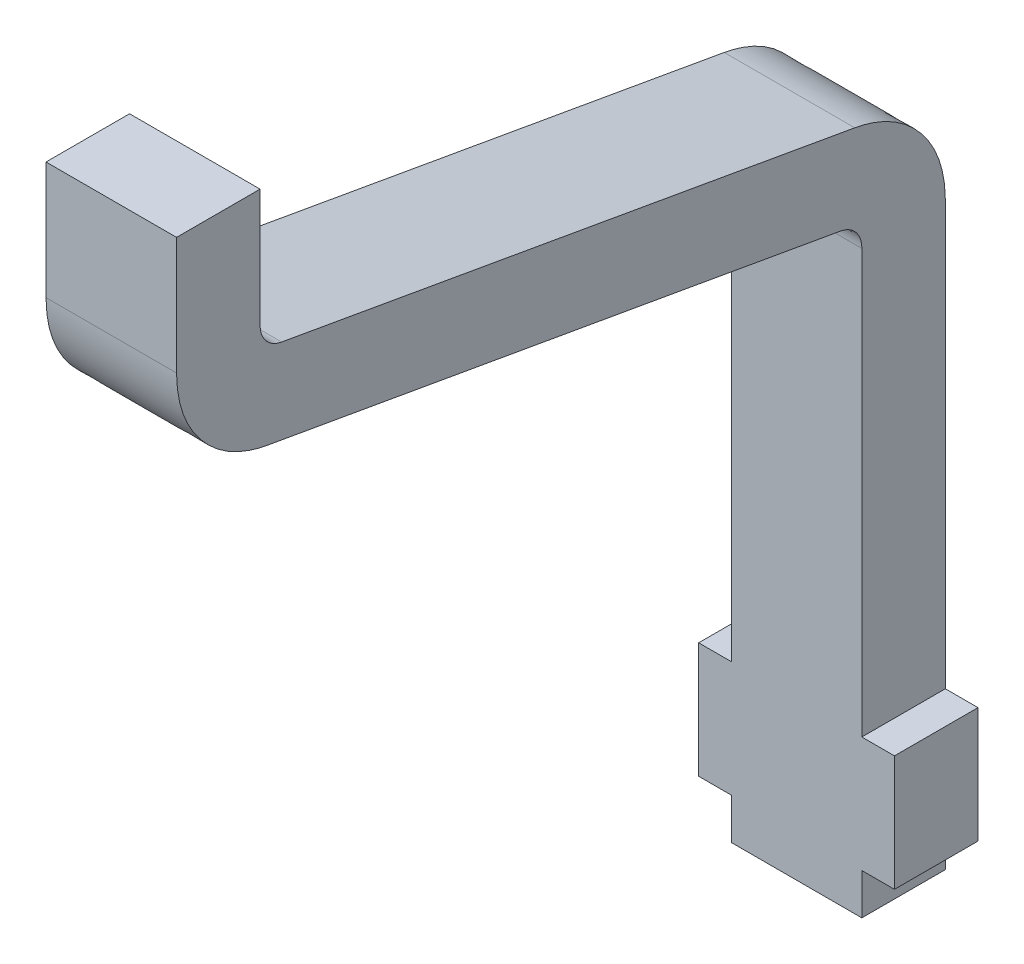
ISO-10303-21;
HEADER;
FILE_DESCRIPTION(('STEP AP214'),'2;1');
FILE_NAME('part.step','',(''),(''),'','','');
FILE_SCHEMA(('AUTOMOTIVE_DESIGN { 1 0 10303 214 1 1 1 1 }'));
ENDSEC;
DATA;
#1=APPLICATION_CONTEXT('core data for automotive mechanical design processes');
#2=APPLICATION_PROTOCOL_DEFINITION('international standard','automotive_design',2000,#1);
#3=PRODUCT_CONTEXT('',#1,'mechanical');
#4=PRODUCT('Part','Part','',(#3));
#5=PRODUCT_RELATED_PRODUCT_CATEGORY('part','',(#4));
#6=PRODUCT_DEFINITION_FORMATION('','',#4);
#7=PRODUCT_DEFINITION_CONTEXT('part definition',#1,'design');
#8=PRODUCT_DEFINITION('design','',#6,#7);
#9=PRODUCT_DEFINITION_SHAPE('','',#8);
#10=(LENGTH_UNIT() NAMED_UNIT(*) SI_UNIT(.MILLI.,.METRE.));
#11=(NAMED_UNIT(*) PLANE_ANGLE_UNIT() SI_UNIT($,.RADIAN.));
#12=(NAMED_UNIT(*) SI_UNIT($,.STERADIAN.) SOLID_ANGLE_UNIT());
#13=UNCERTAINTY_MEASURE_WITH_UNIT(LENGTH_MEASURE(1.E-05),#10,'distance_accuracy_value','');
#14=(GEOMETRIC_REPRESENTATION_CONTEXT(3) GLOBAL_UNCERTAINTY_ASSIGNED_CONTEXT((#13)) GLOBAL_UNIT_ASSIGNED_CONTEXT((#10,
#11,#12)) REPRESENTATION_CONTEXT('',''));
#15=CARTESIAN_POINT('',(0.,0.,0.));
#16=DIRECTION('',(0.,0.,1.));
#17=DIRECTION('',(1.,0.,0.));
#18=AXIS2_PLACEMENT_3D('',#15,#16,#17);
#19=CARTESIAN_POINT('',(-6.77863807396374,4.550984547896,2.240984547896));
#20=DIRECTION('',(-1.,0.,0.));
#21=DIRECTION('',(0.,0.,1.));
#22=AXIS2_PLACEMENT_3D('',#19,#20,#21);
#23=PLANE('',#22);
#24=DIRECTION('',(0.,1.,0.));
#25=VECTOR('',#24,1.);
#26=CARTESIAN_POINT('',(-6.77863807396374,6.33179441896759,2.270984547896));
#27=LINE('',#26,#25);
#28=CARTESIAN_POINT('',(-6.77863807396374,4.580984547896,2.270984547896));
#29=VERTEX_POINT('',#28);
#30=CARTESIAN_POINT('',(-6.77863807396374,6.20179441896759,2.270984547896));
#31=VERTEX_POINT('',#30);
#32=EDGE_CURVE('E205',#29,#31,#27,.T.);
#33=ORIENTED_EDGE('',*,*,#32,.F.);
#34=DIRECTION('',(0.,0.,1.));
#35=VECTOR('',#34,1.);
#36=CARTESIAN_POINT('',(-6.77863807396374,4.580984547896,2.590984547896));
#37=LINE('',#36,#35);
#38=CARTESIAN_POINT('',(-6.77863807396374,4.580984547896,2.590984547896));
#39=VERTEX_POINT('',#38);
#40=EDGE_CURVE('E164',#39,#29,#37,.F.);
#41=ORIENTED_EDGE('',*,*,#40,.F.);
#42=DIRECTION('',(0.,1.,0.));
#43=VECTOR('',#42,1.);
#44=CARTESIAN_POINT('',(-6.77863807396374,4.550984547896,2.590984547896));
#45=LINE('',#44,#43);
#46=CARTESIAN_POINT('',(-6.77863807396374,6.20179441896759,2.590984547896));
#47=VERTEX_POINT('',#46);
#48=EDGE_CURVE('E165',#39,#47,#45,.T.);
#49=ORIENTED_EDGE('',*,*,#48,.T.);
#50=CARTESIAN_POINT('',(-6.77863807396374,6.20179441896759,2.590984547896));
#51=CARTESIAN_POINT('',(-6.77863807396374,6.20753726743895,2.59098555734567));
#52=CARTESIAN_POINT('',(-6.77863807396374,6.21329671503778,2.59141589816356));
#53=CARTESIAN_POINT('',(-6.77863807396374,6.2246630836897,2.59320291073655));
#54=CARTESIAN_POINT('',(-6.77863807396374,6.23027011249996,2.59455890937196));
#55=CARTESIAN_POINT('',(-6.77863807396374,6.2411857001178,2.598275233232));
#56=CARTESIAN_POINT('',(-6.77863807396374,6.24649238283284,2.60064121897459));
#57=CARTESIAN_POINT('',(-6.77863807396374,6.25657549196221,2.60629315965504));
#58=CARTESIAN_POINT('',(-6.77863807396374,6.26135201782258,2.60957894165025));
#59=CARTESIAN_POINT('',(-6.77863807396374,6.27413109218183,2.62012274423325));
#60=CARTESIAN_POINT('',(-6.77863807396374,6.28136928946846,2.62836469975794));
#61=CARTESIAN_POINT('',(-6.77863807396374,6.29260513360912,2.64684944116525));
#62=CARTESIAN_POINT('',(-6.77863807396374,6.2965887855171,2.65710063541284));
#63=CARTESIAN_POINT('',(-6.77863807396374,6.29950962689028,2.66961713994528));
#64=CARTESIAN_POINT('',(-6.77863807396374,6.29991925593881,2.67161590506469));
#65=CARTESIAN_POINT('',(-6.77863807396374,6.30027519062532,2.67361973012931));
#66=B_SPLINE_CURVE_WITH_KNOTS('',3,(#50,#51,#52,#53,#54,#55,#56,#57,#58,#59,#60,#61,#62,#63,#64,
#65),.UNSPECIFIED.,.F.,.F.,(4,2,2,2,2,2,2,4),(0.,0.017238556161182,0.0344645901270159,
0.051788462578373,0.0691090799322486,0.101346274442221,0.133721373842736,0.139837752769888),.UNSPECIFIED.);
#67=CARTESIAN_POINT('',(-6.77863807396374,6.30027519062532,2.67361973012931));
#68=VERTEX_POINT('',#67);
#69=EDGE_CURVE('E21',#47,#68,#66,.T.);
#70=ORIENTED_EDGE('',*,*,#69,.T.);
#71=DIRECTION('',(0.,-0.17364817766693,-0.984807753012208));
#72=VECTOR('',#71,1.);
#73=CARTESIAN_POINT('',(-6.77863807396374,6.29506574529531,2.64407549753894));
#74=LINE('',#73,#72);
#75=CARTESIAN_POINT('',(-6.77863807396374,6.68736529163123,4.86891678251813));
#76=VERTEX_POINT('',#75);
#77=EDGE_CURVE('E178',#76,#68,#74,.T.);
#78=ORIENTED_EDGE('',*,*,#77,.F.);
#79=CARTESIAN_POINT('',(-6.77863807396374,7.100984547896,5.215984547896));
#80=CARTESIAN_POINT('',(-6.77863807396374,7.08883239009785,5.21591937646065));
#81=CARTESIAN_POINT('',(-6.77863807396374,7.07668339031452,5.21542711815011));
#82=CARTESIAN_POINT('',(-6.77863807396374,7.05244664482613,5.21351918836624));
#83=CARTESIAN_POINT('',(-6.77863807396374,7.04035897381041,5.21210258013317));
#84=CARTESIAN_POINT('',(-6.77863807396374,7.00434073280114,5.20636882201667));
#85=CARTESIAN_POINT('',(-6.77863807396374,6.9806210880306,5.20056793472031));
#86=CARTESIAN_POINT('',(-6.77863807396374,6.93447520894348,5.18473229114928));
#87=CARTESIAN_POINT('',(-6.77863807396374,6.91205738089935,5.17467289082895));
#88=CARTESIAN_POINT('',(-6.77863807396374,6.8694801210754,5.15060119772105));
#89=CARTESIAN_POINT('',(-6.77863807396374,6.84931965006307,5.1365907344473));
#90=CARTESIAN_POINT('',(-6.77863807396374,6.8130782802624,5.10643618649113));
#91=CARTESIAN_POINT('',(-6.77863807396374,6.7968081946306,5.09051824531871));
#92=CARTESIAN_POINT('',(-6.77863807396374,6.76721693386031,5.05614511573609));
#93=CARTESIAN_POINT('',(-6.77863807396374,6.75389373220741,5.03769168517858));
#94=CARTESIAN_POINT('',(-6.77863807396374,6.73056491746072,4.99877720264064));
#95=CARTESIAN_POINT('',(-6.77863807396374,6.72056340569958,4.97831370888659));
#96=CARTESIAN_POINT('',(-6.77863807396374,6.7039204026696,4.93608869922421));
#97=CARTESIAN_POINT('',(-6.77863807396374,6.69727752754475,4.91432772205521));
#98=CARTESIAN_POINT('',(-6.77863807396374,6.69038259357711,4.88449758435802));
#99=CARTESIAN_POINT('',(-6.77863807396374,6.68878280972664,4.87672074513799));
#100=CARTESIAN_POINT('',(-6.77863807396374,6.68736529163123,4.86891678251813));
#101=B_SPLINE_CURVE_WITH_KNOTS('',3,(#79,#80,#81,#82,#83,#84,#85,#86,#87,#88,#89,#90,#91,#92,
#93,#94,#95,#96,#97,#98,#99,#100),.UNSPECIFIED.,.F.,.F.,(4,2,2,2,2,2,2,2,2,2,4),(0.,
0.0364447161959692,0.0729264238784269,0.145789443137374,0.219080012919287,0.292336701548788,
0.360320805384211,0.428258011516145,0.4962787914031,0.564271521863333,0.588078345120833),.UNSPECIFIED.);
#102=CARTESIAN_POINT('',(-6.77863807396374,7.100984547896,5.215984547896));
#103=VERTEX_POINT('',#102);
#104=EDGE_CURVE('E285',#103,#76,#101,.T.);
#105=ORIENTED_EDGE('',*,*,#104,.F.);
#106=DIRECTION('',(0.,1.,0.));
#107=VECTOR('',#106,1.);
#108=CARTESIAN_POINT('',(-6.77863807396374,7.070984547896,5.215984547896));
#109=LINE('',#108,#107);
#110=CARTESIAN_POINT('',(-6.77863807396374,7.550984547896,5.215984547896));
#111=VERTEX_POINT('',#110);
#112=EDGE_CURVE('E182',#111,#103,#109,.F.);
#113=ORIENTED_EDGE('',*,*,#112,.F.);
#114=DIRECTION('',(0.,0.,-1.));
#115=VECTOR('',#114,1.);
#116=CARTESIAN_POINT('',(-6.77863807396374,7.550984547896,5.24598454789601));
#117=LINE('',#116,#115);
#118=CARTESIAN_POINT('',(-6.77863807396374,7.550984547896,4.895984547896));
#119=VERTEX_POINT('',#118);
#120=EDGE_CURVE('E188',#111,#119,#117,.T.);
#121=ORIENTED_EDGE('',*,*,#120,.T.);
#122=DIRECTION('',(0.,1.,0.));
#123=VECTOR('',#122,1.);
#124=CARTESIAN_POINT('',(-6.77863807396374,7.070984547896,4.895984547896));
#125=LINE('',#124,#123);
#126=CARTESIAN_POINT('',(-6.77863807396374,7.100984547896,4.895984547896));
#127=VERTEX_POINT('',#126);
#128=EDGE_CURVE('E194',#127,#119,#125,.T.);
#129=ORIENTED_EDGE('',*,*,#128,.F.);
#130=CARTESIAN_POINT('',(-6.77863807396374,7.00250377259513,4.81334936566471));
#131=CARTESIAN_POINT('',(-6.77863807396374,7.00350200195311,4.81900479247235));
#132=CARTESIAN_POINT('',(-6.77863807396374,7.0049259226042,4.82460201361728));
#133=CARTESIAN_POINT('',(-6.77863807396374,7.00865953589999,4.83548539089273));
#134=CARTESIAN_POINT('',(-6.77863807396374,7.0109685843645,4.84077177002885));
#135=CARTESIAN_POINT('',(-6.77863807396374,7.01652392120461,4.85087619321296));
#136=CARTESIAN_POINT('',(-6.77863807396374,7.01977545832262,4.85569140673157));
#137=CARTESIAN_POINT('',(-6.77863807396374,7.02709244738196,4.86463988221837));
#138=CARTESIAN_POINT('',(-6.77863807396374,7.03115774627628,4.86877327215326));
#139=CARTESIAN_POINT('',(-6.77863807396374,7.04376042862659,4.8795272921308));
#140=CARTESIAN_POINT('',(-6.77863807396374,7.05313407071043,4.88522432458835));
#141=CARTESIAN_POINT('',(-6.77863807396374,7.07328907191604,4.89307962900701));
#142=CARTESIAN_POINT('',(-6.77863807396374,7.08407628137846,4.89522265876101));
#143=CARTESIAN_POINT('',(-6.77863807396374,7.09690982963115,4.89592565734588));
#144=CARTESIAN_POINT('',(-6.77863807396374,7.09894935918849,4.89598198122784));
#145=CARTESIAN_POINT('',(-6.77863807396374,7.100984547896,4.895984547896));
#146=B_SPLINE_CURVE_WITH_KNOTS('',3,(#130,#131,#132,#133,#134,#135,#136,#137,#138,#139,#140,
#141,#142,#143,#144,#145),.UNSPECIFIED.,.F.,.F.,(4,2,2,2,2,2,2,4),(0.,0.0172385573765554,
0.0344645925861347,0.051788466289741,0.0691090848881165,0.101346281177337,0.133721380344783,
0.139837755776289),.UNSPECIFIED.);
#147=CARTESIAN_POINT('',(-6.77863807396374,7.00250377259513,4.81334936566471));
#148=VERTEX_POINT('',#147);
#149=EDGE_CURVE('E313',#148,#127,#146,.T.);
#150=ORIENTED_EDGE('',*,*,#149,.F.);
#151=DIRECTION('',(0.,0.17364817766693,0.984807753012208));
#152=VECTOR('',#151,1.);
#153=CARTESIAN_POINT('',(-6.77863807396374,6.61020422625922,2.58850808068553));
#154=LINE('',#153,#152);
#155=CARTESIAN_POINT('',(-6.77863807396374,6.61541367158922,2.61805231327589));
#156=VERTEX_POINT('',#155);
#157=EDGE_CURVE('E200',#156,#148,#154,.T.);
#158=ORIENTED_EDGE('',*,*,#157,.F.);
#159=CARTESIAN_POINT('',(-6.77863807396374,6.20179441896759,2.270984547896));
#160=CARTESIAN_POINT('',(-6.77863807396374,6.2139465765696,2.27104971933121));
#161=CARTESIAN_POINT('',(-6.77863807396374,6.22609557615675,2.27154197763767));
#162=CARTESIAN_POINT('',(-6.77863807396374,6.2503323212524,2.27344990740251));
#163=CARTESIAN_POINT('',(-6.77863807396374,6.26241999207158,2.27486651562058));
#164=CARTESIAN_POINT('',(-6.77863807396374,6.29843823248389,2.28060027366992));
#165=CARTESIAN_POINT('',(-6.77863807396374,6.32215787685567,2.28640116089191));
#166=CARTESIAN_POINT('',(-6.77863807396374,6.36830375516317,2.30223680422815));
#167=CARTESIAN_POINT('',(-6.77863807396374,6.39072158282685,2.31229620438677));
#168=CARTESIAN_POINT('',(-6.77863807396374,6.43329884194366,2.33636789708385));
#169=CARTESIAN_POINT('',(-6.77863807396374,6.45345931262897,2.35037836010908));
#170=CARTESIAN_POINT('',(-6.77863807396374,6.48970068196938,2.38053290757986));
#171=CARTESIAN_POINT('',(-6.77863807396374,6.50597076744986,2.3964508485364));
#172=CARTESIAN_POINT('',(-6.77863807396374,6.53556202799779,2.43082397763534));
#173=CARTESIAN_POINT('',(-6.77863807396374,6.54888522957937,2.44927740792529));
#174=CARTESIAN_POINT('',(-6.77863807396374,6.57221404440498,2.48819189012085));
#175=CARTESIAN_POINT('',(-6.77863807396374,6.58221555627867,2.50865538382254));
#176=CARTESIAN_POINT('',(-6.77863807396374,6.59885855954947,2.55088039339732));
#177=CARTESIAN_POINT('',(-6.77863807396374,6.60550143480209,2.57264137053124));
#178=CARTESIAN_POINT('',(-6.77863807396374,6.61239636920221,2.6024715092705));
#179=CARTESIAN_POINT('',(-6.77863807396374,6.6139961532976,2.61024834956975));
#180=CARTESIAN_POINT('',(-6.77863807396374,6.61541367158922,2.61805231327589));
#181=B_SPLINE_CURVE_WITH_KNOTS('',3,(#159,#160,#161,#162,#163,#164,#165,#166,#167,#168,#169,
#170,#171,#172,#173,#174,#175,#176,#177,#178,#179,#180),.UNSPECIFIED.,.F.,.F.,(4,2,2,2,2,2,2,2,
2,2,4),(0.,0.036444715607616,0.0729264226993133,0.145789440750173,0.219080009303174,
0.29233669671443,0.360320799781691,0.428258005151271,0.496278785044542,0.564271515521181,
0.588078342093036),.UNSPECIFIED.);
#182=EDGE_CURVE('E221',#31,#156,#181,.T.);
#183=ORIENTED_EDGE('',*,*,#182,.F.);
#184=EDGE_LOOP('',(#33,#41,#49,#70,#78,#105,#113,#121,#129,#150,#158,#183));
#185=FACE_BOUND('',#184,.T.);
#186=ADVANCED_FACE('F17',(#185),#23,.T.);
#187=CARTESIAN_POINT('',(-6.90363807396374,4.580984547896,2.590984547896));
#188=DIRECTION('',(0.,1.,0.));
#189=DIRECTION('',(0.,0.,1.));
#190=AXIS2_PLACEMENT_3D('',#187,#188,#189);
#191=PLANE('',#190);
#192=DIRECTION('',(0.,0.,1.));
#193=VECTOR('',#192,1.);
#194=CARTESIAN_POINT('',(-6.90363807396374,4.580984547896,2.590984547896));
#195=LINE('',#194,#193);
#196=CARTESIAN_POINT('',(-6.90363807396374,4.580984547896,2.590984547896));
#197=VERTEX_POINT('',#196);
#198=CARTESIAN_POINT('',(-6.90363807396374,4.580984547896,2.270984547896));
#199=VERTEX_POINT('',#198);
#200=EDGE_CURVE('E491',#197,#199,#195,.F.);
#201=ORIENTED_EDGE('',*,*,#200,.F.);
#202=DIRECTION('',(1.,0.,0.));
#203=VECTOR('',#202,1.);
#204=CARTESIAN_POINT('',(-7.04113807396374,4.580984547896,2.590984547896));
#205=LINE('',#204,#203);
#206=EDGE_CURVE('E171',#39,#197,#205,.F.);
#207=ORIENTED_EDGE('',*,*,#206,.F.);
#208=ORIENTED_EDGE('',*,*,#40,.T.);
#209=DIRECTION('',(-1.,0.,0.));
#210=VECTOR('',#209,1.);
#211=CARTESIAN_POINT('',(-7.04113807396374,4.580984547896,2.270984547896));
#212=LINE('',#211,#210);
#213=EDGE_CURVE('E218',#199,#29,#212,.F.);
#214=ORIENTED_EDGE('',*,*,#213,.F.);
#215=EDGE_LOOP('',(#201,#207,#208,#214));
#216=FACE_BOUND('',#215,.T.);
#217=ADVANCED_FACE('F389',(#216),#191,.T.);
#218=CARTESIAN_POINT('',(-6.90363807396374,4.1381566124251,2.590984547896));
#219=DIRECTION('',(-1.,0.,0.));
#220=DIRECTION('',(0.,-1.,0.));
#221=AXIS2_PLACEMENT_3D('',#218,#219,#220);
#222=PLANE('',#221);
#223=DIRECTION('',(0.,1.,0.));
#224=VECTOR('',#223,1.);
#225=CARTESIAN_POINT('',(-6.90363807396374,6.33179441896759,2.270984547896));
#226=LINE('',#225,#224);
#227=CARTESIAN_POINT('',(-6.90363807396374,4.1381566124251,2.270984547896));
#228=VERTEX_POINT('',#227);
#229=EDGE_CURVE('E222',#228,#199,#226,.T.);
#230=ORIENTED_EDGE('',*,*,#229,.F.);
#231=DIRECTION('',(0.,0.,-1.));
#232=VECTOR('',#231,1.);
#233=CARTESIAN_POINT('',(-6.90363807396374,4.1381566124251,2.590984547896));
#234=LINE('',#233,#232);
#235=CARTESIAN_POINT('',(-6.90363807396374,4.1381566124251,2.590984547896));
#236=VERTEX_POINT('',#235);
#237=EDGE_CURVE('E482',#236,#228,#234,.T.);
#238=ORIENTED_EDGE('',*,*,#237,.F.);
#239=DIRECTION('',(0.,-1.,0.));
#240=VECTOR('',#239,1.);
#241=CARTESIAN_POINT('',(-6.90363807396374,3.850984547896,2.590984547896));
#242=LINE('',#241,#240);
#243=EDGE_CURVE('E487',#197,#236,#242,.T.);
#244=ORIENTED_EDGE('',*,*,#243,.F.);
#245=ORIENTED_EDGE('',*,*,#200,.T.);
#246=EDGE_LOOP('',(#230,#238,#244,#245));
#247=FACE_BOUND('',#246,.T.);
#248=ADVANCED_FACE('F386',(#247),#222,.T.);
#249=CARTESIAN_POINT('',(-6.77863807396374,4.1381566124251,2.590984547896));
#250=DIRECTION('',(0.,-1.,0.));
#251=DIRECTION('',(0.,0.,-1.));
#252=AXIS2_PLACEMENT_3D('',#249,#250,#251);
#253=PLANE('',#252);
#254=DIRECTION('',(-1.,0.,0.));
#255=VECTOR('',#254,1.);
#256=CARTESIAN_POINT('',(-7.04113807396374,4.1381566124251,2.270984547896));
#257=LINE('',#256,#255);
#258=CARTESIAN_POINT('',(-6.77863807396374,4.1381566124251,2.270984547896));
#259=VERTEX_POINT('',#258);
#260=EDGE_CURVE('E237',#259,#228,#257,.T.);
#261=ORIENTED_EDGE('',*,*,#260,.F.);
#262=DIRECTION('',(0.,0.,1.));
#263=VECTOR('',#262,1.);
#264=CARTESIAN_POINT('',(-6.77863807396374,4.1381566124251,2.590984547896));
#265=LINE('',#264,#263);
#266=CARTESIAN_POINT('',(-6.77863807396374,4.1381566124251,2.590984547896));
#267=VERTEX_POINT('',#266);
#268=EDGE_CURVE('E473',#267,#259,#265,.F.);
#269=ORIENTED_EDGE('',*,*,#268,.F.);
#270=DIRECTION('',(1.,0.,0.));
#271=VECTOR('',#270,1.);
#272=CARTESIAN_POINT('',(-7.04113807396374,4.1381566124251,2.590984547896));
#273=LINE('',#272,#271);
#274=EDGE_CURVE('E478',#236,#267,#273,.T.);
#275=ORIENTED_EDGE('',*,*,#274,.F.);
#276=ORIENTED_EDGE('',*,*,#237,.T.);
#277=EDGE_LOOP('',(#261,#269,#275,#276));
#278=FACE_BOUND('',#277,.T.);
#279=ADVANCED_FACE('F382',(#278),#253,.T.);
#280=CARTESIAN_POINT('',(-6.77863807396374,3.980984547896,2.590984547896));
#281=DIRECTION('',(-1.,0.,0.));
#282=DIRECTION('',(0.,0.,1.));
#283=AXIS2_PLACEMENT_3D('',#280,#281,#282);
#284=PLANE('',#283);
#285=DIRECTION('',(0.,1.,0.));
#286=VECTOR('',#285,1.);
#287=CARTESIAN_POINT('',(-6.77863807396374,6.33179441896759,2.270984547896));
#288=LINE('',#287,#286);
#289=CARTESIAN_POINT('',(-6.77863807396374,3.980984547896,2.270984547896));
#290=VERTEX_POINT('',#289);
#291=EDGE_CURVE('E232',#290,#259,#288,.T.);
#292=ORIENTED_EDGE('',*,*,#291,.F.);
#293=DIRECTION('',(0.,0.,-1.));
#294=VECTOR('',#293,1.);
#295=CARTESIAN_POINT('',(-6.77863807396374,3.980984547896,2.590984547896));
#296=LINE('',#295,#294);
#297=CARTESIAN_POINT('',(-6.77863807396374,3.980984547896,2.590984547896));
#298=VERTEX_POINT('',#297);
#299=EDGE_CURVE('E464',#298,#290,#296,.T.);
#300=ORIENTED_EDGE('',*,*,#299,.F.);
#301=DIRECTION('',(0.,-1.,0.));
#302=VECTOR('',#301,1.);
#303=CARTESIAN_POINT('',(-6.77863807396374,3.850984547896,2.590984547896));
#304=LINE('',#303,#302);
#305=EDGE_CURVE('E469',#267,#298,#304,.T.);
#306=ORIENTED_EDGE('',*,*,#305,.F.);
#307=ORIENTED_EDGE('',*,*,#268,.T.);
#308=EDGE_LOOP('',(#292,#300,#306,#307));
#309=FACE_BOUND('',#308,.T.);
#310=ADVANCED_FACE('F378',(#309),#284,.T.);
#311=CARTESIAN_POINT('',(-6.27863807396374,3.980984547896,2.590984547896));
#312=DIRECTION('',(0.,-1.,0.));
#313=DIRECTION('',(0.,0.,-1.));
#314=AXIS2_PLACEMENT_3D('',#311,#312,#313);
#315=PLANE('',#314);
#316=DIRECTION('',(-1.,0.,0.));
#317=VECTOR('',#316,1.);
#318=CARTESIAN_POINT('',(-7.04113807396374,3.980984547896,2.270984547896));
#319=LINE('',#318,#317);
#320=CARTESIAN_POINT('',(-6.27863807396374,3.980984547896,2.270984547896));
#321=VERTEX_POINT('',#320);
#322=EDGE_CURVE('E227',#321,#290,#319,.T.);
#323=ORIENTED_EDGE('',*,*,#322,.F.);
#324=DIRECTION('',(0.,0.,-1.));
#325=VECTOR('',#324,1.);
#326=CARTESIAN_POINT('',(-6.27863807396374,3.980984547896,2.590984547896));
#327=LINE('',#326,#325);
#328=CARTESIAN_POINT('',(-6.27863807396374,3.980984547896,2.590984547896));
#329=VERTEX_POINT('',#328);
#330=EDGE_CURVE('E455',#329,#321,#327,.T.);
#331=ORIENTED_EDGE('',*,*,#330,.F.);
#332=DIRECTION('',(1.,0.,0.));
#333=VECTOR('',#332,1.);
#334=CARTESIAN_POINT('',(-7.04113807396374,3.980984547896,2.590984547896));
#335=LINE('',#334,#333);
#336=EDGE_CURVE('E460',#298,#329,#335,.T.);
#337=ORIENTED_EDGE('',*,*,#336,.F.);
#338=ORIENTED_EDGE('',*,*,#299,.T.);
#339=EDGE_LOOP('',(#323,#331,#337,#338));
#340=FACE_BOUND('',#339,.T.);
#341=ADVANCED_FACE('F374',(#340),#315,.T.);
#342=CARTESIAN_POINT('',(-6.27863807396374,4.1381566124251,2.590984547896));
#343=DIRECTION('',(1.,0.,0.));
#344=DIRECTION('',(0.,0.,-1.));
#345=AXIS2_PLACEMENT_3D('',#342,#343,#344);
#346=PLANE('',#345);
#347=DIRECTION('',(0.,1.,0.));
#348=VECTOR('',#347,1.);
#349=CARTESIAN_POINT('',(-6.27863807396374,6.33179441896759,2.270984547896));
#350=LINE('',#349,#348);
#351=CARTESIAN_POINT('',(-6.27863807396374,4.1381566124251,2.270984547896));
#352=VERTEX_POINT('',#351);
#353=EDGE_CURVE('E215',#352,#321,#350,.F.);
#354=ORIENTED_EDGE('',*,*,#353,.F.);
#355=DIRECTION('',(0.,0.,-1.));
#356=VECTOR('',#355,1.);
#357=CARTESIAN_POINT('',(-6.27863807396374,4.1381566124251,2.590984547896));
#358=LINE('',#357,#356);
#359=CARTESIAN_POINT('',(-6.27863807396374,4.1381566124251,2.590984547896));
#360=VERTEX_POINT('',#359);
#361=EDGE_CURVE('E449',#360,#352,#358,.T.);
#362=ORIENTED_EDGE('',*,*,#361,.F.);
#363=DIRECTION('',(0.,-1.,0.));
#364=VECTOR('',#363,1.);
#365=CARTESIAN_POINT('',(-6.27863807396374,3.850984547896,2.590984547896));
#366=LINE('',#365,#364);
#367=EDGE_CURVE('E441',#329,#360,#366,.F.);
#368=ORIENTED_EDGE('',*,*,#367,.F.);
#369=ORIENTED_EDGE('',*,*,#330,.T.);
#370=EDGE_LOOP('',(#354,#362,#368,#369));
#371=FACE_BOUND('',#370,.T.);
#372=ADVANCED_FACE('F370',(#371),#346,.T.);
#373=CARTESIAN_POINT('',(-6.15363807396374,4.1381566124251,2.590984547896));
#374=DIRECTION('',(0.,-1.,0.));
#375=DIRECTION('',(0.,0.,-1.));
#376=AXIS2_PLACEMENT_3D('',#373,#374,#375);
#377=PLANE('',#376);
#378=DIRECTION('',(-1.,0.,0.));
#379=VECTOR('',#378,1.);
#380=CARTESIAN_POINT('',(-7.04113807396374,4.1381566124251,2.270984547896));
#381=LINE('',#380,#379);
#382=CARTESIAN_POINT('',(-6.15363807396374,4.1381566124251,2.270984547896));
#383=VERTEX_POINT('',#382);
#384=EDGE_CURVE('E212',#383,#352,#381,.T.);
#385=ORIENTED_EDGE('',*,*,#384,.F.);
#386=DIRECTION('',(0.,0.,-1.));
#387=VECTOR('',#386,1.);
#388=CARTESIAN_POINT('',(-6.15363807396374,4.1381566124251,2.590984547896));
#389=LINE('',#388,#387);
#390=CARTESIAN_POINT('',(-6.15363807396374,4.1381566124251,2.590984547896));
#391=VERTEX_POINT('',#390);
#392=EDGE_CURVE('E209',#391,#383,#389,.T.);
#393=ORIENTED_EDGE('',*,*,#392,.F.);
#394=DIRECTION('',(1.,0.,0.));
#395=VECTOR('',#394,1.);
#396=CARTESIAN_POINT('',(-7.04113807396374,4.1381566124251,2.590984547896));
#397=LINE('',#396,#395);
#398=EDGE_CURVE('E436',#360,#391,#397,.T.);
#399=ORIENTED_EDGE('',*,*,#398,.F.);
#400=ORIENTED_EDGE('',*,*,#361,.T.);
#401=EDGE_LOOP('',(#385,#393,#399,#400));
#402=FACE_BOUND('',#401,.T.);
#403=ADVANCED_FACE('F366',(#402),#377,.T.);
#404=CARTESIAN_POINT('',(-6.15363807396374,4.580984547896,2.590984547896));
#405=DIRECTION('',(1.,0.,0.));
#406=DIRECTION('',(0.,0.,-1.));
#407=AXIS2_PLACEMENT_3D('',#404,#405,#406);
#408=PLANE('',#407);
#409=DIRECTION('',(0.,1.,0.));
#410=VECTOR('',#409,1.);
#411=CARTESIAN_POINT('',(-6.15363807396374,6.33179441896759,2.270984547896));
#412=LINE('',#411,#410);
#413=CARTESIAN_POINT('',(-6.15363807396374,4.580984547896,2.270984547896));
#414=VERTEX_POINT('',#413);
#415=EDGE_CURVE('E208',#414,#383,#412,.F.);
#416=ORIENTED_EDGE('',*,*,#415,.F.);
#417=DIRECTION('',(0.,0.,1.));
#418=VECTOR('',#417,1.);
#419=CARTESIAN_POINT('',(-6.15363807396374,4.580984547896,2.590984547896));
#420=LINE('',#419,#418);
#421=CARTESIAN_POINT('',(-6.15363807396374,4.580984547896,2.590984547896));
#422=VERTEX_POINT('',#421);
#423=EDGE_CURVE('E432',#422,#414,#420,.F.);
#424=ORIENTED_EDGE('',*,*,#423,.F.);
#425=DIRECTION('',(0.,-1.,0.));
#426=VECTOR('',#425,1.);
#427=CARTESIAN_POINT('',(-6.15363807396374,3.850984547896,2.590984547896));
#428=LINE('',#427,#426);
#429=EDGE_CURVE('E433',#391,#422,#428,.F.);
#430=ORIENTED_EDGE('',*,*,#429,.F.);
#431=ORIENTED_EDGE('',*,*,#392,.T.);
#432=EDGE_LOOP('',(#416,#424,#430,#431));
#433=FACE_BOUND('',#432,.T.);
#434=ADVANCED_FACE('F362',(#433),#408,.T.);
#435=CARTESIAN_POINT('',(-7.04113807396374,6.33179441896759,2.270984547896));
#436=DIRECTION('',(0.,0.,-1.));
#437=DIRECTION('',(-1.,0.,0.));
#438=AXIS2_PLACEMENT_3D('',#435,#436,#437);
#439=PLANE('',#438);
#440=ORIENTED_EDGE('',*,*,#229,.T.);
#441=ORIENTED_EDGE('',*,*,#213,.T.);
#442=ORIENTED_EDGE('',*,*,#32,.T.);
#443=DIRECTION('',(1.,0.,0.));
#444=VECTOR('',#443,1.);
#445=CARTESIAN_POINT('',(-6.77863807396374,6.20179441896759,2.270984547896));
#446=LINE('',#445,#444);
#447=CARTESIAN_POINT('',(-6.27863807396374,6.20179441896759,2.270984547896));
#448=VERTEX_POINT('',#447);
#449=EDGE_CURVE('E204',#448,#31,#446,.F.);
#450=ORIENTED_EDGE('',*,*,#449,.F.);
#451=DIRECTION('',(0.,1.,0.));
#452=VECTOR('',#451,1.);
#453=CARTESIAN_POINT('',(-6.27863807396374,4.550984547896,2.270984547896));
#454=LINE('',#453,#452);
#455=CARTESIAN_POINT('',(-6.27863807396374,4.580984547896,2.270984547896));
#456=VERTEX_POINT('',#455);
#457=EDGE_CURVE('E426',#456,#448,#454,.T.);
#458=ORIENTED_EDGE('',*,*,#457,.F.);
#459=DIRECTION('',(1.,0.,0.));
#460=VECTOR('',#459,1.);
#461=CARTESIAN_POINT('',(-6.90363807396374,4.580984547896,2.270984547896));
#462=LINE('',#461,#460);
#463=EDGE_CURVE('E428',#414,#456,#462,.F.);
#464=ORIENTED_EDGE('',*,*,#463,.F.);
#465=ORIENTED_EDGE('',*,*,#415,.T.);
#466=ORIENTED_EDGE('',*,*,#384,.T.);
#467=ORIENTED_EDGE('',*,*,#353,.T.);
#468=ORIENTED_EDGE('',*,*,#322,.T.);
#469=ORIENTED_EDGE('',*,*,#291,.T.);
#470=ORIENTED_EDGE('',*,*,#260,.T.);
#471=EDGE_LOOP('',(#440,#441,#442,#450,#458,#464,#465,#466,#467,#468,#469,#470));
#472=FACE_BOUND('',#471,.T.);
#473=ADVANCED_FACE('F357',(#472),#439,.T.);
#474=CARTESIAN_POINT('',(-6.77863807396374,6.20179441896759,2.270984547896));
#475=CARTESIAN_POINT('',(-6.77863807396374,6.31310090331076,2.27157966819527));
#476=CARTESIAN_POINT('',(-6.77863807396374,6.4928189359509,2.34415503314688));
#477=CARTESIAN_POINT('',(-6.77863807396374,6.59549942437317,2.50854016618098));
#478=CARTESIAN_POINT('',(-6.77863807396374,6.61541367158922,2.61805231327589));
#479=(BOUNDED_CURVE() B_SPLINE_CURVE(3,(#474,#475,#476,#477,#478),.UNSPECIFIED.,.F.,
.F.) B_SPLINE_CURVE_WITH_KNOTS((4,1,4),(0.,0.5,1.),
.UNSPECIFIED.) CURVE() GEOMETRIC_REPRESENTATION_ITEM() RATIONAL_B_SPLINE_CURVE((1.,1.,1.,1.,1.)) REPRESENTATION_ITEM(''));
#480=DIRECTION('',(1.,0.,0.));
#481=VECTOR('',#480,1.);
#482=SURFACE_OF_LINEAR_EXTRUSION('',#479,#481);
#483=CARTESIAN_POINT('',(-6.27863807396374,6.20179441896759,2.270984547896));
#484=CARTESIAN_POINT('',(-6.27863807396374,6.2139465765696,2.27104971933121));
#485=CARTESIAN_POINT('',(-6.27863807396374,6.22609557615675,2.27154197763767));
#486=CARTESIAN_POINT('',(-6.27863807396374,6.2503323212524,2.27344990740251));
#487=CARTESIAN_POINT('',(-6.27863807396374,6.26241999207158,2.27486651562058));
#488=CARTESIAN_POINT('',(-6.27863807396374,6.29843823248389,2.28060027366992));
#489=CARTESIAN_POINT('',(-6.27863807396374,6.32215787685567,2.28640116089191));
#490=CARTESIAN_POINT('',(-6.27863807396374,6.36830375516317,2.30223680422815));
#491=CARTESIAN_POINT('',(-6.27863807396374,6.39072158282685,2.31229620438677));
#492=CARTESIAN_POINT('',(-6.27863807396374,6.43329884194366,2.33636789708385));
#493=CARTESIAN_POINT('',(-6.27863807396374,6.45345931262897,2.35037836010908));
#494=CARTESIAN_POINT('',(-6.27863807396374,6.48970068196938,2.38053290757986));
#495=CARTESIAN_POINT('',(-6.27863807396374,6.50597076744986,2.3964508485364));
#496=CARTESIAN_POINT('',(-6.27863807396374,6.53556202799779,2.43082397763534));
#497=CARTESIAN_POINT('',(-6.27863807396374,6.54888522957937,2.44927740792529));
#498=CARTESIAN_POINT('',(-6.27863807396374,6.57221404440498,2.48819189012085));
#499=CARTESIAN_POINT('',(-6.27863807396374,6.58221555627867,2.50865538382254));
#500=CARTESIAN_POINT('',(-6.27863807396374,6.59885855954947,2.55088039339732));
#501=CARTESIAN_POINT('',(-6.27863807396374,6.60550143480209,2.57264137053124));
#502=CARTESIAN_POINT('',(-6.27863807396374,6.61239636920221,2.6024715092705));
#503=CARTESIAN_POINT('',(-6.27863807396374,6.6139961532976,2.61024834956975));
#504=CARTESIAN_POINT('',(-6.27863807396374,6.61541367158922,2.61805231327589));
#505=B_SPLINE_CURVE_WITH_KNOTS('',3,(#483,#484,#485,#486,#487,#488,#489,#490,#491,#492,#493,
#494,#495,#496,#497,#498,#499,#500,#501,#502,#503,#504),.UNSPECIFIED.,.F.,.F.,(4,2,2,2,2,2,2,2,
2,2,4),(0.,0.036444715607616,0.0729264226993133,0.145789440750173,0.219080009303174,
0.29233669671443,0.360320799781691,0.428258005151271,0.496278785044542,0.564271515521181,
0.588078342093036),.UNSPECIFIED.);
#506=CARTESIAN_POINT('',(-6.27863807396374,6.61541367158922,2.61805231327589));
#507=VERTEX_POINT('',#506);
#508=EDGE_CURVE('E308',#448,#507,#505,.T.);
#509=ORIENTED_EDGE('',*,*,#508,.F.);
#510=ORIENTED_EDGE('',*,*,#449,.T.);
#511=ORIENTED_EDGE('',*,*,#182,.T.);
#512=DIRECTION('',(1.,0.,0.));
#513=VECTOR('',#512,1.);
#514=CARTESIAN_POINT('',(-6.24863807396374,6.61541367158923,2.61805231327589));
#515=LINE('',#514,#513);
#516=EDGE_CURVE('E203',#507,#156,#515,.F.);
#517=ORIENTED_EDGE('',*,*,#516,.F.);
#518=EDGE_LOOP('',(#509,#510,#511,#517));
#519=FACE_BOUND('',#518,.T.);
#520=ADVANCED_FACE('F353',(#519),#482,.T.);
#521=CARTESIAN_POINT('',(-6.24863807396374,6.61020422625922,2.58850808068553));
#522=DIRECTION('',(0.,0.984807753012208,-0.17364817766693));
#523=DIRECTION('',(0.,0.17364817766693,0.984807753012208));
#524=AXIS2_PLACEMENT_3D('',#521,#522,#523);
#525=PLANE('',#524);
#526=DIRECTION('',(0.,0.173648177666929,0.984807753012208));
#527=VECTOR('',#526,1.);
#528=CARTESIAN_POINT('',(-6.27863807396374,6.61541367158922,2.61805231327589));
#529=LINE('',#528,#527);
#530=CARTESIAN_POINT('',(-6.27863807396374,7.00250377259513,4.81334936566471));
#531=VERTEX_POINT('',#530);
#532=EDGE_CURVE('E423',#507,#531,#529,.T.);
#533=ORIENTED_EDGE('',*,*,#532,.F.);
#534=ORIENTED_EDGE('',*,*,#516,.T.);
#535=ORIENTED_EDGE('',*,*,#157,.T.);
#536=DIRECTION('',(1.,0.,0.));
#537=VECTOR('',#536,1.);
#538=CARTESIAN_POINT('',(-6.77863807396374,7.00250377259513,4.81334936566471));
#539=LINE('',#538,#537);
#540=EDGE_CURVE('E197',#531,#148,#539,.F.);
#541=ORIENTED_EDGE('',*,*,#540,.F.);
#542=EDGE_LOOP('',(#533,#534,#535,#541));
#543=FACE_BOUND('',#542,.T.);
#544=ADVANCED_FACE('F329',(#543),#525,.T.);
#545=CARTESIAN_POINT('',(-6.77863807396374,7.00250377259513,4.81334936566471));
#546=CARTESIAN_POINT('',(-6.77863807396374,7.00716686833956,4.83943782002403));
#547=CARTESIAN_POINT('',(-6.77863807396374,7.03169299582076,4.87856300401731));
#548=CARTESIAN_POINT('',(-6.77863807396374,7.07448269769923,4.8959225076115));
#549=CARTESIAN_POINT('',(-6.77863807396374,7.100984547896,4.895984547896));
#550=(BOUNDED_CURVE() B_SPLINE_CURVE(3,(#545,#546,#547,#548,#549),.UNSPECIFIED.,.F.,
.F.) B_SPLINE_CURVE_WITH_KNOTS((4,1,4),(0.,0.499999999999999,1.),
.UNSPECIFIED.) CURVE() GEOMETRIC_REPRESENTATION_ITEM() RATIONAL_B_SPLINE_CURVE((1.,1.,1.,1.,1.)) REPRESENTATION_ITEM(''));
#551=DIRECTION('',(1.,0.,0.));
#552=VECTOR('',#551,1.);
#553=SURFACE_OF_LINEAR_EXTRUSION('',#550,#552);
#554=CARTESIAN_POINT('',(-6.27863807396374,7.00250377259513,4.81334936566471));
#555=CARTESIAN_POINT('',(-6.27863807396374,7.00350200195311,4.81900479247235));
#556=CARTESIAN_POINT('',(-6.27863807396374,7.0049259226042,4.82460201361728));
#557=CARTESIAN_POINT('',(-6.27863807396374,7.00865953589999,4.83548539089274));
#558=CARTESIAN_POINT('',(-6.27863807396374,7.0109685843645,4.84077177002885));
#559=CARTESIAN_POINT('',(-6.27863807396374,7.01652392120461,4.85087619321296));
#560=CARTESIAN_POINT('',(-6.27863807396374,7.01977545832262,4.85569140673157));
#561=CARTESIAN_POINT('',(-6.27863807396374,7.02709244738196,4.86463988221838));
#562=CARTESIAN_POINT('',(-6.27863807396374,7.03115774627629,4.86877327215326));
#563=CARTESIAN_POINT('',(-6.27863807396374,7.0437604286266,4.8795272921308));
#564=CARTESIAN_POINT('',(-6.27863807396374,7.05313407071044,4.88522432458835));
#565=CARTESIAN_POINT('',(-6.27863807396374,7.07328907191605,4.89307962900701));
#566=CARTESIAN_POINT('',(-6.27863807396374,7.08407628137847,4.89522265876101));
#567=CARTESIAN_POINT('',(-6.27863807396374,7.09690982963116,4.89592565734588));
#568=CARTESIAN_POINT('',(-6.27863807396374,7.0989493591885,4.89598198122784));
#569=CARTESIAN_POINT('',(-6.27863807396374,7.100984547896,4.895984547896));
#570=B_SPLINE_CURVE_WITH_KNOTS('',3,(#554,#555,#556,#557,#558,#559,#560,#561,#562,#563,#564,
#565,#566,#567,#568,#569),.UNSPECIFIED.,.F.,.F.,(4,2,2,2,2,2,2,4),(0.,0.0172385573765554,
0.0344645925861363,0.051788466289743,0.0691090848881216,0.101346281177342,0.133721380344791,
0.139837755776288),.UNSPECIFIED.);
#571=CARTESIAN_POINT('',(-6.27863807396374,7.100984547896,4.895984547896));
#572=VERTEX_POINT('',#571);
#573=EDGE_CURVE('E420',#531,#572,#570,.T.);
#574=ORIENTED_EDGE('',*,*,#573,.F.);
#575=ORIENTED_EDGE('',*,*,#540,.T.);
#576=ORIENTED_EDGE('',*,*,#149,.T.);
#577=DIRECTION('',(-1.,0.,0.));
#578=VECTOR('',#577,1.);
#579=CARTESIAN_POINT('',(-6.24863807396374,7.100984547896,4.895984547896));
#580=LINE('',#579,#578);
#581=EDGE_CURVE('E191',#572,#127,#580,.T.);
#582=ORIENTED_EDGE('',*,*,#581,.F.);
#583=EDGE_LOOP('',(#574,#575,#576,#582));
#584=FACE_BOUND('',#583,.T.);
#585=ADVANCED_FACE('F322',(#584),#553,.T.);
#586=CARTESIAN_POINT('',(-6.24863807396374,7.070984547896,4.895984547896));
#587=DIRECTION('',(0.,0.,-1.));
#588=DIRECTION('',(-1.,0.,0.));
#589=AXIS2_PLACEMENT_3D('',#586,#587,#588);
#590=PLANE('',#589);
#591=DIRECTION('',(0.,1.,0.));
#592=VECTOR('',#591,1.);
#593=CARTESIAN_POINT('',(-6.27863807396374,4.550984547896,4.895984547896));
#594=LINE('',#593,#592);
#595=CARTESIAN_POINT('',(-6.27863807396374,7.550984547896,4.895984547896));
#596=VERTEX_POINT('',#595);
#597=EDGE_CURVE('E417',#572,#596,#594,.T.);
#598=ORIENTED_EDGE('',*,*,#597,.F.);
#599=ORIENTED_EDGE('',*,*,#581,.T.);
#600=ORIENTED_EDGE('',*,*,#128,.T.);
#601=DIRECTION('',(1.,0.,0.));
#602=VECTOR('',#601,1.);
#603=CARTESIAN_POINT('',(-6.24863807396374,7.550984547896,4.895984547896));
#604=LINE('',#603,#602);
#605=EDGE_CURVE('E190',#119,#596,#604,.T.);
#606=ORIENTED_EDGE('',*,*,#605,.T.);
#607=EDGE_LOOP('',(#598,#599,#600,#606));
#608=FACE_BOUND('',#607,.T.);
#609=ADVANCED_FACE('F328',(#608),#590,.T.);
#610=CARTESIAN_POINT('',(-6.24863807396374,7.550984547896,5.24598454789601));
#611=DIRECTION('',(0.,-1.,0.));
#612=DIRECTION('',(0.,0.,-1.));
#613=AXIS2_PLACEMENT_3D('',#610,#611,#612);
#614=PLANE('',#613);
#615=DIRECTION('',(0.,0.,-1.));
#616=VECTOR('',#615,1.);
#617=CARTESIAN_POINT('',(-6.27863807396374,7.550984547896,2.620984547896));
#618=LINE('',#617,#616);
#619=CARTESIAN_POINT('',(-6.27863807396374,7.550984547896,5.215984547896));
#620=VERTEX_POINT('',#619);
#621=EDGE_CURVE('E414',#596,#620,#618,.F.);
#622=ORIENTED_EDGE('',*,*,#621,.F.);
#623=ORIENTED_EDGE('',*,*,#605,.F.);
#624=ORIENTED_EDGE('',*,*,#120,.F.);
#625=DIRECTION('',(1.,0.,0.));
#626=VECTOR('',#625,1.);
#627=CARTESIAN_POINT('',(-6.80863807396373,7.550984547896,5.215984547896));
#628=LINE('',#627,#626);
#629=EDGE_CURVE('E185',#620,#111,#628,.F.);
#630=ORIENTED_EDGE('',*,*,#629,.F.);
#631=EDGE_LOOP('',(#622,#623,#624,#630));
#632=FACE_BOUND('',#631,.T.);
#633=ADVANCED_FACE('F546',(#632),#614,.F.);
#634=CARTESIAN_POINT('',(-6.80863807396373,7.070984547896,5.215984547896));
#635=DIRECTION('',(0.,0.,1.));
#636=DIRECTION('',(1.,0.,0.));
#637=AXIS2_PLACEMENT_3D('',#634,#635,#636);
#638=PLANE('',#637);
#639=ORIENTED_EDGE('',*,*,#112,.T.);
#640=DIRECTION('',(-1.,0.,0.));
#641=VECTOR('',#640,1.);
#642=CARTESIAN_POINT('',(-6.27863807396374,7.100984547896,5.215984547896));
#643=LINE('',#642,#641);
#644=CARTESIAN_POINT('',(-6.27863807396374,7.100984547896,5.215984547896));
#645=VERTEX_POINT('',#644);
#646=EDGE_CURVE('E184',#645,#103,#643,.T.);
#647=ORIENTED_EDGE('',*,*,#646,.F.);
#648=DIRECTION('',(0.,1.,0.));
#649=VECTOR('',#648,1.);
#650=CARTESIAN_POINT('',(-6.27863807396374,4.550984547896,5.215984547896));
#651=LINE('',#650,#649);
#652=EDGE_CURVE('E411',#620,#645,#651,.F.);
#653=ORIENTED_EDGE('',*,*,#652,.F.);
#654=ORIENTED_EDGE('',*,*,#629,.T.);
#655=EDGE_LOOP('',(#639,#647,#653,#654));
#656=FACE_BOUND('',#655,.T.);
#657=ADVANCED_FACE('F298',(#656),#638,.T.);
#658=CARTESIAN_POINT('',(-6.27863807396374,6.68736529163123,4.86891678251813));
#659=CARTESIAN_POINT('',(-6.27863807396374,6.70727953897007,4.97842893022428));
#660=CARTESIAN_POINT('',(-6.27863807396374,6.80996002918311,5.14281406360691));
#661=CARTESIAN_POINT('',(-6.27863807396374,6.98967806302602,5.2153894276029));
#662=CARTESIAN_POINT('',(-6.27863807396374,7.100984547896,5.215984547896));
#663=(BOUNDED_CURVE() B_SPLINE_CURVE(3,(#658,#659,#660,#661,#662),.UNSPECIFIED.,.F.,
.F.) B_SPLINE_CURVE_WITH_KNOTS((4,1,4),(0.,0.5,1.),
.UNSPECIFIED.) CURVE() GEOMETRIC_REPRESENTATION_ITEM() RATIONAL_B_SPLINE_CURVE((1.,1.,1.,1.,1.)) REPRESENTATION_ITEM(''));
#664=DIRECTION('',(-1.,0.,0.));
#665=VECTOR('',#664,1.);
#666=SURFACE_OF_LINEAR_EXTRUSION('',#663,#665);
#667=ORIENTED_EDGE('',*,*,#104,.T.);
#668=DIRECTION('',(1.,0.,0.));
#669=VECTOR('',#668,1.);
#670=CARTESIAN_POINT('',(-6.80863807396373,6.68736529163123,4.86891678251812));
#671=LINE('',#670,#669);
#672=CARTESIAN_POINT('',(-6.27863807396374,6.68736529163123,4.86891678251812));
#673=VERTEX_POINT('',#672);
#674=EDGE_CURVE('E282',#673,#76,#671,.F.);
#675=ORIENTED_EDGE('',*,*,#674,.F.);
#676=CARTESIAN_POINT('',(-6.27863807396374,7.100984547896,5.215984547896));
#677=CARTESIAN_POINT('',(-6.27863807396374,7.08883239009785,5.21591937646065));
#678=CARTESIAN_POINT('',(-6.27863807396374,7.07668339031452,5.21542711815011));
#679=CARTESIAN_POINT('',(-6.27863807396374,7.05244664482613,5.21351918836624));
#680=CARTESIAN_POINT('',(-6.27863807396374,7.04035897381041,5.21210258013317));
#681=CARTESIAN_POINT('',(-6.27863807396374,7.00434073280114,5.20636882201667));
#682=CARTESIAN_POINT('',(-6.27863807396374,6.9806210880306,5.20056793472031));
#683=CARTESIAN_POINT('',(-6.27863807396374,6.93447520894348,5.18473229114928));
#684=CARTESIAN_POINT('',(-6.27863807396374,6.91205738089935,5.17467289082895));
#685=CARTESIAN_POINT('',(-6.27863807396374,6.8694801210754,5.15060119772105));
#686=CARTESIAN_POINT('',(-6.27863807396374,6.84931965006307,5.1365907344473));
#687=CARTESIAN_POINT('',(-6.27863807396374,6.8130782802624,5.10643618649113));
#688=CARTESIAN_POINT('',(-6.27863807396374,6.7968081946306,5.09051824531871));
#689=CARTESIAN_POINT('',(-6.27863807396374,6.76721693386031,5.05614511573609));
#690=CARTESIAN_POINT('',(-6.27863807396374,6.75389373220741,5.03769168517858));
#691=CARTESIAN_POINT('',(-6.27863807396374,6.73056491746072,4.99877720264064));
#692=CARTESIAN_POINT('',(-6.27863807396374,6.72056340569958,4.97831370888659));
#693=CARTESIAN_POINT('',(-6.27863807396374,6.7039204026696,4.93608869922421));
#694=CARTESIAN_POINT('',(-6.27863807396374,6.69727752754475,4.91432772205521));
#695=CARTESIAN_POINT('',(-6.27863807396374,6.69038259357711,4.88449758435802));
#696=CARTESIAN_POINT('',(-6.27863807396374,6.68878280972664,4.87672074513799));
#697=CARTESIAN_POINT('',(-6.27863807396374,6.68736529163123,4.86891678251813));
#698=B_SPLINE_CURVE_WITH_KNOTS('',3,(#676,#677,#678,#679,#680,#681,#682,#683,#684,#685,#686,
#687,#688,#689,#690,#691,#692,#693,#694,#695,#696,#697),.UNSPECIFIED.,.F.,.F.,(4,2,2,2,2,2,2,2,
2,2,4),(0.,0.0364447161959692,0.0729264238784269,0.145789443137374,0.219080012919287,
0.292336701548788,0.360320805384211,0.428258011516145,0.4962787914031,0.564271521863333,
0.588078345120833),.UNSPECIFIED.);
#699=EDGE_CURVE('E255',#645,#673,#698,.T.);
#700=ORIENTED_EDGE('',*,*,#699,.F.);
#701=ORIENTED_EDGE('',*,*,#646,.T.);
#702=EDGE_LOOP('',(#667,#675,#700,#701));
#703=FACE_BOUND('',#702,.T.);
#704=ADVANCED_FACE('F294',(#703),#666,.T.);
#705=CARTESIAN_POINT('',(-6.80863807396373,6.29506574529531,2.64407549753894));
#706=DIRECTION('',(0.,-0.984807753012208,0.17364817766693));
#707=DIRECTION('',(0.,-0.17364817766693,-0.984807753012208));
#708=AXIS2_PLACEMENT_3D('',#705,#706,#707);
#709=PLANE('',#708);
#710=ORIENTED_EDGE('',*,*,#77,.T.);
#711=DIRECTION('',(-1.,0.,0.));
#712=VECTOR('',#711,1.);
#713=CARTESIAN_POINT('',(-6.27863807396374,6.30027519062532,2.67361973012931));
#714=LINE('',#713,#712);
#715=CARTESIAN_POINT('',(-6.27863807396374,6.30027519062532,2.67361973012931));
#716=VERTEX_POINT('',#715);
#717=EDGE_CURVE('E159',#716,#68,#714,.T.);
#718=ORIENTED_EDGE('',*,*,#717,.F.);
#719=DIRECTION('',(0.,-0.17364817766693,-0.984807753012208));
#720=VECTOR('',#719,1.);
#721=CARTESIAN_POINT('',(-6.27863807396374,6.68736529163123,4.86891678251812));
#722=LINE('',#721,#720);
#723=EDGE_CURVE('E254',#673,#716,#722,.T.);
#724=ORIENTED_EDGE('',*,*,#723,.F.);
#725=ORIENTED_EDGE('',*,*,#674,.T.);
#726=EDGE_LOOP('',(#710,#718,#724,#725));
#727=FACE_BOUND('',#726,.T.);
#728=ADVANCED_FACE('F269',(#727),#709,.T.);
#729=CARTESIAN_POINT('',(-6.27863807396374,6.20179441896759,2.590984547896));
#730=CARTESIAN_POINT('',(-6.27863807396374,6.22829626742844,2.59104658817428));
#731=CARTESIAN_POINT('',(-6.27863807396374,6.27108596702184,2.60840609081377));
#732=CARTESIAN_POINT('',(-6.27863807396374,6.29561209477764,2.64753127519333));
#733=CARTESIAN_POINT('',(-6.27863807396374,6.30027519062532,2.67361973012931));
#734=(BOUNDED_CURVE() B_SPLINE_CURVE(3,(#729,#730,#731,#732,#733),.UNSPECIFIED.,.F.,
.F.) B_SPLINE_CURVE_WITH_KNOTS((4,1,4),(0.,0.500000000000002,1.),
.UNSPECIFIED.) CURVE() GEOMETRIC_REPRESENTATION_ITEM() RATIONAL_B_SPLINE_CURVE((1.,1.,1.,1.,1.)) REPRESENTATION_ITEM(''));
#735=DIRECTION('',(-1.,0.,0.));
#736=VECTOR('',#735,1.);
#737=SURFACE_OF_LINEAR_EXTRUSION('',#734,#736);
#738=ORIENTED_EDGE('',*,*,#69,.F.);
#739=DIRECTION('',(1.,0.,0.));
#740=VECTOR('',#739,1.);
#741=CARTESIAN_POINT('',(-7.04113807396374,6.20179441896759,2.590984547896));
#742=LINE('',#741,#740);
#743=CARTESIAN_POINT('',(-6.27863807396374,6.20179441896759,2.590984547896));
#744=VERTEX_POINT('',#743);
#745=EDGE_CURVE('E158',#744,#47,#742,.F.);
#746=ORIENTED_EDGE('',*,*,#745,.F.);
#747=CARTESIAN_POINT('',(-6.27863807396374,6.30027519062532,2.67361973012931));
#748=CARTESIAN_POINT('',(-6.27863807396374,6.29927696123089,2.66796430312334));
#749=CARTESIAN_POINT('',(-6.27863807396374,6.29785304052941,2.66236708178068));
#750=CARTESIAN_POINT('',(-6.27863807396374,6.29411942709489,2.65148370411343));
#751=CARTESIAN_POINT('',(-6.27863807396374,6.29181037854056,2.64619732478374));
#752=CARTESIAN_POINT('',(-6.27863807396374,6.2862550414747,2.63609290123665));
#753=CARTESIAN_POINT('',(-6.27863807396374,6.28300350422036,2.63127768754884));
#754=CARTESIAN_POINT('',(-6.27863807396374,6.27568651484721,2.62232921176793));
#755=CARTESIAN_POINT('',(-6.27863807396374,6.27162121577581,2.61819582170779));
#756=CARTESIAN_POINT('',(-6.27863807396374,6.25901853302117,2.60744180165566));
#757=CARTESIAN_POINT('',(-6.27863807396374,6.24964489068583,2.60174476928734));
#758=CARTESIAN_POINT('',(-6.27863807396374,6.22948988961385,2.59388946567649));
#759=CARTESIAN_POINT('',(-6.27863807396374,6.21870268062537,2.59174643641116));
#760=CARTESIAN_POINT('',(-6.27863807396374,6.20586913435896,2.59104343837339));
#761=CARTESIAN_POINT('',(-6.27863807396374,6.20382960624137,2.59098711456416));
#762=CARTESIAN_POINT('',(-6.27863807396374,6.20179441896759,2.590984547896));
#763=B_SPLINE_CURVE_WITH_KNOTS('',3,(#747,#748,#749,#750,#751,#752,#753,#754,#755,#756,#757,
#758,#759,#760,#761,#762),.UNSPECIFIED.,.F.,.F.,(4,2,2,2,2,2,2,4),(0.,0.0172385579840374,
0.0344645938294777,0.0517884681752705,0.0691090874076755,0.101346284107456,0.133721381597173,
0.139837752713997),.UNSPECIFIED.);
#764=EDGE_CURVE('E248',#716,#744,#763,.T.);
#765=ORIENTED_EDGE('',*,*,#764,.F.);
#766=ORIENTED_EDGE('',*,*,#717,.T.);
#767=EDGE_LOOP('',(#738,#746,#765,#766));
#768=FACE_BOUND('',#767,.T.);
#769=ADVANCED_FACE('F156',(#768),#737,.T.);
#770=CARTESIAN_POINT('',(-7.04113807396374,3.850984547896,2.590984547896));
#771=DIRECTION('',(0.,0.,1.));
#772=DIRECTION('',(0.,-1.,0.));
#773=AXIS2_PLACEMENT_3D('',#770,#771,#772);
#774=PLANE('',#773);
#775=ORIENTED_EDGE('',*,*,#429,.T.);
#776=DIRECTION('',(1.,0.,0.));
#777=VECTOR('',#776,1.);
#778=CARTESIAN_POINT('',(-6.90363807396374,4.580984547896,2.590984547896));
#779=LINE('',#778,#777);
#780=CARTESIAN_POINT('',(-6.27863807396374,4.580984547896,2.590984547896));
#781=VERTEX_POINT('',#780);
#782=EDGE_CURVE('E40',#781,#422,#779,.T.);
#783=ORIENTED_EDGE('',*,*,#782,.F.);
#784=DIRECTION('',(0.,1.,0.));
#785=VECTOR('',#784,1.);
#786=CARTESIAN_POINT('',(-6.27863807396374,4.550984547896,2.590984547896));
#787=LINE('',#786,#785);
#788=EDGE_CURVE('E31',#744,#781,#787,.F.);
#789=ORIENTED_EDGE('',*,*,#788,.F.);
#790=ORIENTED_EDGE('',*,*,#745,.T.);
#791=ORIENTED_EDGE('',*,*,#48,.F.);
#792=ORIENTED_EDGE('',*,*,#206,.T.);
#793=ORIENTED_EDGE('',*,*,#243,.T.);
#794=ORIENTED_EDGE('',*,*,#274,.T.);
#795=ORIENTED_EDGE('',*,*,#305,.T.);
#796=ORIENTED_EDGE('',*,*,#336,.T.);
#797=ORIENTED_EDGE('',*,*,#367,.T.);
#798=ORIENTED_EDGE('',*,*,#398,.T.);
#799=EDGE_LOOP('',(#775,#783,#789,#790,#791,#792,#793,#794,#795,#796,#797,#798));
#800=FACE_BOUND('',#799,.T.);
#801=ADVANCED_FACE('F166',(#800),#774,.T.);
#802=CARTESIAN_POINT('',(-6.90363807396374,4.580984547896,2.590984547896));
#803=DIRECTION('',(0.,1.,0.));
#804=DIRECTION('',(0.,0.,1.));
#805=AXIS2_PLACEMENT_3D('',#802,#803,#804);
#806=PLANE('',#805);
#807=ORIENTED_EDGE('',*,*,#423,.T.);
#808=ORIENTED_EDGE('',*,*,#463,.T.);
#809=DIRECTION('',(0.,0.,-1.));
#810=VECTOR('',#809,1.);
#811=CARTESIAN_POINT('',(-6.27863807396374,4.580984547896,2.620984547896));
#812=LINE('',#811,#810);
#813=EDGE_CURVE('E11',#781,#456,#812,.T.);
#814=ORIENTED_EDGE('',*,*,#813,.F.);
#815=ORIENTED_EDGE('',*,*,#782,.T.);
#816=EDGE_LOOP('',(#807,#808,#814,#815));
#817=FACE_BOUND('',#816,.T.);
#818=ADVANCED_FACE('F398',(#817),#806,.T.);
#819=CARTESIAN_POINT('',(-6.27863807396374,4.550984547896,2.620984547896));
#820=DIRECTION('',(1.,0.,0.));
#821=DIRECTION('',(0.,0.,-1.));
#822=AXIS2_PLACEMENT_3D('',#819,#820,#821);
#823=PLANE('',#822);
#824=ORIENTED_EDGE('',*,*,#788,.T.);
#825=ORIENTED_EDGE('',*,*,#813,.T.);
#826=ORIENTED_EDGE('',*,*,#457,.T.);
#827=ORIENTED_EDGE('',*,*,#508,.T.);
#828=ORIENTED_EDGE('',*,*,#532,.T.);
#829=ORIENTED_EDGE('',*,*,#573,.T.);
#830=ORIENTED_EDGE('',*,*,#597,.T.);
#831=ORIENTED_EDGE('',*,*,#621,.T.);
#832=ORIENTED_EDGE('',*,*,#652,.T.);
#833=ORIENTED_EDGE('',*,*,#699,.T.);
#834=ORIENTED_EDGE('',*,*,#723,.T.);
#835=ORIENTED_EDGE('',*,*,#764,.T.);
#836=EDGE_LOOP('',(#824,#825,#826,#827,#828,#829,#830,#831,#832,#833,#834,#835));
#837=FACE_BOUND('',#836,.T.);
#838=ADVANCED_FACE('F261',(#837),#823,.T.);
#839=CLOSED_SHELL('',(#186,#217,#248,#279,#310,#341,#372,#403,#434,#473,#520,#544,#585,#609,
#633,#657,#704,#728,#769,#801,#818,#838));
#840=MANIFOLD_SOLID_BREP('B1',#839);
#841=ADVANCED_BREP_SHAPE_REPRESENTATION('',(#18,#840),#14);
#842=SHAPE_DEFINITION_REPRESENTATION(#9,#841);
ENDSEC;
END-ISO-10303-21;
